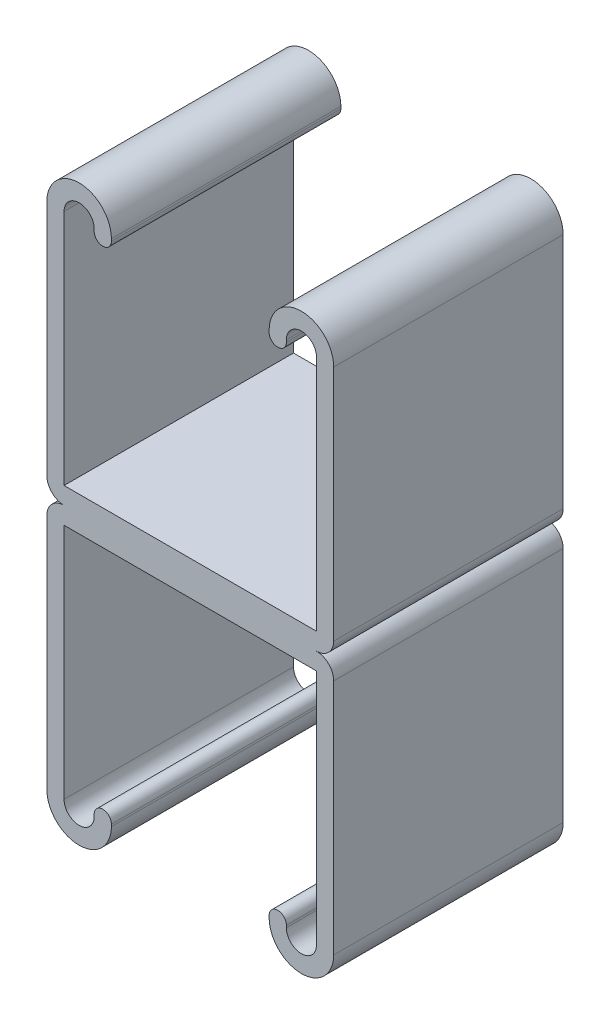
ISO-10303-21;
HEADER;
FILE_DESCRIPTION(('STEP AP214'),'2;1');
FILE_NAME('part.step','',(''),(''),'','','');
FILE_SCHEMA(('AUTOMOTIVE_DESIGN { 1 0 10303 214 1 1 1 1 }'));
ENDSEC;
DATA;
#1=APPLICATION_CONTEXT('core data for automotive mechanical design processes');
#2=APPLICATION_PROTOCOL_DEFINITION('international standard','automotive_design',2000,#1);
#3=PRODUCT_CONTEXT('',#1,'mechanical');
#4=PRODUCT('Part','Part','',(#3));
#5=PRODUCT_RELATED_PRODUCT_CATEGORY('part','',(#4));
#6=PRODUCT_DEFINITION_FORMATION('','',#4);
#7=PRODUCT_DEFINITION_CONTEXT('part definition',#1,'design');
#8=PRODUCT_DEFINITION('design','',#6,#7);
#9=PRODUCT_DEFINITION_SHAPE('','',#8);
#10=(LENGTH_UNIT() NAMED_UNIT(*) SI_UNIT(.MILLI.,.METRE.));
#11=(NAMED_UNIT(*) PLANE_ANGLE_UNIT() SI_UNIT($,.RADIAN.));
#12=(NAMED_UNIT(*) SI_UNIT($,.STERADIAN.) SOLID_ANGLE_UNIT());
#13=UNCERTAINTY_MEASURE_WITH_UNIT(LENGTH_MEASURE(1.E-05),#10,'distance_accuracy_value','');
#14=(GEOMETRIC_REPRESENTATION_CONTEXT(3) GLOBAL_UNCERTAINTY_ASSIGNED_CONTEXT((#13)) GLOBAL_UNIT_ASSIGNED_CONTEXT((#10,
#11,#12)) REPRESENTATION_CONTEXT('',''));
#15=CARTESIAN_POINT('',(0.,0.,0.));
#16=DIRECTION('',(0.,0.,1.));
#17=DIRECTION('',(1.,0.,0.));
#18=AXIS2_PLACEMENT_3D('',#15,#16,#17);
#19=CARTESIAN_POINT('',(-12.303125,28.178125,12.7));
#20=DIRECTION('',(0.,0.,-1.));
#21=DIRECTION('',(-1.,0.,0.));
#22=AXIS2_PLACEMENT_3D('',#19,#20,#21);
#23=CYLINDRICAL_SURFACE('',#22,3.571875);
#24=CARTESIAN_POINT('',(-12.303125,28.178125,-12.7));
#25=DIRECTION('',(0.,0.,1.));
#26=DIRECTION('',(-1.,0.,0.));
#27=AXIS2_PLACEMENT_3D('',#24,#25,#26);
#28=CIRCLE('',#27,3.571875);
#29=CARTESIAN_POINT('',(-8.73125,28.178125,-12.7));
#30=VERTEX_POINT('',#29);
#31=CARTESIAN_POINT('',(-15.875,28.178125,-12.7));
#32=VERTEX_POINT('',#31);
#33=EDGE_CURVE('E189',#30,#32,#28,.T.);
#34=ORIENTED_EDGE('',*,*,#33,.T.);
#35=DIRECTION('',(0.,0.,-1.));
#36=VECTOR('',#35,1.);
#37=CARTESIAN_POINT('',(-15.875,28.178125,12.7));
#38=LINE('',#37,#36);
#39=CARTESIAN_POINT('',(-15.875,28.178125,12.7));
#40=VERTEX_POINT('',#39);
#41=EDGE_CURVE('E11',#40,#32,#38,.T.);
#42=ORIENTED_EDGE('',*,*,#41,.F.);
#43=CARTESIAN_POINT('',(-12.303125,28.178125,12.7));
#44=DIRECTION('',(0.,0.,1.));
#45=DIRECTION('',(-1.,0.,0.));
#46=AXIS2_PLACEMENT_3D('',#43,#44,#45);
#47=CIRCLE('',#46,3.571875);
#48=CARTESIAN_POINT('',(-8.73125,28.178125,12.7));
#49=VERTEX_POINT('',#48);
#50=EDGE_CURVE('E222',#49,#40,#47,.T.);
#51=ORIENTED_EDGE('',*,*,#50,.F.);
#52=DIRECTION('',(0.,0.,-1.));
#53=VECTOR('',#52,1.);
#54=CARTESIAN_POINT('',(-8.73125,28.178125,12.7));
#55=LINE('',#54,#53);
#56=EDGE_CURVE('E185',#49,#30,#55,.T.);
#57=ORIENTED_EDGE('',*,*,#56,.T.);
#58=EDGE_LOOP('',(#34,#42,#51,#57));
#59=FACE_BOUND('',#58,.T.);
#60=ADVANCED_FACE('F32',(#59),#23,.T.);
#61=CARTESIAN_POINT('',(-15.875,28.178125,12.7));
#62=DIRECTION('',(1.,0.,0.));
#63=DIRECTION('',(0.,1.,0.));
#64=AXIS2_PLACEMENT_3D('',#61,#62,#63);
#65=PLANE('',#64);
#66=DIRECTION('',(0.,-1.,0.));
#67=VECTOR('',#66,1.);
#68=CARTESIAN_POINT('',(-15.875,28.178125,-12.7));
#69=LINE('',#68,#67);
#70=CARTESIAN_POINT('',(-15.875,1.905,-12.7));
#71=VERTEX_POINT('',#70);
#72=EDGE_CURVE('E192',#32,#71,#69,.T.);
#73=ORIENTED_EDGE('',*,*,#72,.T.);
#74=DIRECTION('',(0.,0.,-1.));
#75=VECTOR('',#74,1.);
#76=CARTESIAN_POINT('',(-15.875,1.905,12.7));
#77=LINE('',#76,#75);
#78=CARTESIAN_POINT('',(-15.875,1.905,12.7));
#79=VERTEX_POINT('',#78);
#80=EDGE_CURVE('E40',#79,#71,#77,.T.);
#81=ORIENTED_EDGE('',*,*,#80,.F.);
#82=DIRECTION('',(0.,-1.,0.));
#83=VECTOR('',#82,1.);
#84=CARTESIAN_POINT('',(-15.875,28.178125,12.7));
#85=LINE('',#84,#83);
#86=EDGE_CURVE('E119',#40,#79,#85,.T.);
#87=ORIENTED_EDGE('',*,*,#86,.F.);
#88=ORIENTED_EDGE('',*,*,#41,.T.);
#89=EDGE_LOOP('',(#73,#81,#87,#88));
#90=FACE_BOUND('',#89,.T.);
#91=ADVANCED_FACE('F384',(#90),#65,.F.);
#92=CARTESIAN_POINT('',(-13.97,1.905,12.7));
#93=DIRECTION('',(0.,0.,-1.));
#94=DIRECTION('',(-1.,0.,0.));
#95=AXIS2_PLACEMENT_3D('',#92,#93,#94);
#96=CYLINDRICAL_SURFACE('',#95,1.905);
#97=CARTESIAN_POINT('',(-13.97,1.905,-12.7));
#98=DIRECTION('',(0.,0.,1.));
#99=DIRECTION('',(-1.,0.,0.));
#100=AXIS2_PLACEMENT_3D('',#97,#98,#99);
#101=CIRCLE('',#100,1.905);
#102=CARTESIAN_POINT('',(-13.97,0.,-12.7));
#103=VERTEX_POINT('',#102);
#104=EDGE_CURVE('E195',#71,#103,#101,.T.);
#105=ORIENTED_EDGE('',*,*,#104,.T.);
#106=DIRECTION('',(0.,0.,-1.));
#107=VECTOR('',#106,1.);
#108=CARTESIAN_POINT('',(-13.97,0.,12.7));
#109=LINE('',#108,#107);
#110=CARTESIAN_POINT('',(-13.97,0.,12.7));
#111=VERTEX_POINT('',#110);
#112=EDGE_CURVE('E259',#111,#103,#109,.T.);
#113=ORIENTED_EDGE('',*,*,#112,.F.);
#114=CARTESIAN_POINT('',(-13.97,1.905,12.7));
#115=DIRECTION('',(0.,0.,1.));
#116=DIRECTION('',(-1.,0.,0.));
#117=AXIS2_PLACEMENT_3D('',#114,#115,#116);
#118=CIRCLE('',#117,1.905);
#119=EDGE_CURVE('E267',#79,#111,#118,.T.);
#120=ORIENTED_EDGE('',*,*,#119,.F.);
#121=ORIENTED_EDGE('',*,*,#80,.T.);
#122=EDGE_LOOP('',(#105,#113,#120,#121));
#123=FACE_BOUND('',#122,.T.);
#124=ADVANCED_FACE('F265',(#123),#96,.T.);
#125=CARTESIAN_POINT('',(13.97,1.905,12.7));
#126=DIRECTION('',(0.,0.,-1.));
#127=DIRECTION('',(-1.,0.,0.));
#128=AXIS2_PLACEMENT_3D('',#125,#126,#127);
#129=CYLINDRICAL_SURFACE('',#128,1.905);
#130=CARTESIAN_POINT('',(13.97,1.905,-12.7));
#131=DIRECTION('',(0.,0.,1.));
#132=DIRECTION('',(1.,0.,0.));
#133=AXIS2_PLACEMENT_3D('',#130,#131,#132);
#134=CIRCLE('',#133,1.905);
#135=CARTESIAN_POINT('',(13.97,0.,-12.7));
#136=VERTEX_POINT('',#135);
#137=CARTESIAN_POINT('',(15.875,1.905,-12.7));
#138=VERTEX_POINT('',#137);
#139=EDGE_CURVE('E197',#136,#138,#134,.T.);
#140=ORIENTED_EDGE('',*,*,#139,.T.);
#141=DIRECTION('',(0.,0.,-1.));
#142=VECTOR('',#141,1.);
#143=CARTESIAN_POINT('',(15.875,1.905,12.7));
#144=LINE('',#143,#142);
#145=CARTESIAN_POINT('',(15.875,1.905,12.7));
#146=VERTEX_POINT('',#145);
#147=EDGE_CURVE('E253',#146,#138,#144,.T.);
#148=ORIENTED_EDGE('',*,*,#147,.F.);
#149=CARTESIAN_POINT('',(13.97,1.905,12.7));
#150=DIRECTION('',(0.,0.,1.));
#151=DIRECTION('',(1.,0.,0.));
#152=AXIS2_PLACEMENT_3D('',#149,#150,#151);
#153=CIRCLE('',#152,1.905);
#154=CARTESIAN_POINT('',(13.97,0.,12.7));
#155=VERTEX_POINT('',#154);
#156=EDGE_CURVE('E341',#155,#146,#153,.T.);
#157=ORIENTED_EDGE('',*,*,#156,.F.);
#158=DIRECTION('',(0.,0.,-1.));
#159=VECTOR('',#158,1.);
#160=CARTESIAN_POINT('',(13.97,0.,12.7));
#161=LINE('',#160,#159);
#162=EDGE_CURVE('E256',#155,#136,#161,.T.);
#163=ORIENTED_EDGE('',*,*,#162,.T.);
#164=EDGE_LOOP('',(#140,#148,#157,#163));
#165=FACE_BOUND('',#164,.T.);
#166=ADVANCED_FACE('F391',(#165),#129,.T.);
#167=CARTESIAN_POINT('',(15.875,1.905,12.7));
#168=DIRECTION('',(-1.,0.,0.));
#169=DIRECTION('',(0.,0.,1.));
#170=AXIS2_PLACEMENT_3D('',#167,#168,#169);
#171=PLANE('',#170);
#172=DIRECTION('',(0.,1.,0.));
#173=VECTOR('',#172,1.);
#174=CARTESIAN_POINT('',(15.875,1.905,-12.7));
#175=LINE('',#174,#173);
#176=CARTESIAN_POINT('',(15.875,28.178125,-12.7));
#177=VERTEX_POINT('',#176);
#178=EDGE_CURVE('E199',#138,#177,#175,.T.);
#179=ORIENTED_EDGE('',*,*,#178,.T.);
#180=DIRECTION('',(0.,0.,-1.));
#181=VECTOR('',#180,1.);
#182=CARTESIAN_POINT('',(15.875,28.178125,12.7));
#183=LINE('',#182,#181);
#184=CARTESIAN_POINT('',(15.875,28.178125,12.7));
#185=VERTEX_POINT('',#184);
#186=EDGE_CURVE('E250',#185,#177,#183,.T.);
#187=ORIENTED_EDGE('',*,*,#186,.F.);
#188=DIRECTION('',(0.,1.,0.));
#189=VECTOR('',#188,1.);
#190=CARTESIAN_POINT('',(15.875,1.905,12.7));
#191=LINE('',#190,#189);
#192=EDGE_CURVE('E343',#146,#185,#191,.T.);
#193=ORIENTED_EDGE('',*,*,#192,.F.);
#194=ORIENTED_EDGE('',*,*,#147,.T.);
#195=EDGE_LOOP('',(#179,#187,#193,#194));
#196=FACE_BOUND('',#195,.T.);
#197=ADVANCED_FACE('F396',(#196),#171,.F.);
#198=CARTESIAN_POINT('',(12.303125,28.178125,12.7));
#199=DIRECTION('',(0.,0.,-1.));
#200=DIRECTION('',(-1.,0.,0.));
#201=AXIS2_PLACEMENT_3D('',#198,#199,#200);
#202=CYLINDRICAL_SURFACE('',#201,3.571875);
#203=CARTESIAN_POINT('',(12.303125,28.178125,-12.7));
#204=DIRECTION('',(0.,0.,1.));
#205=DIRECTION('',(1.,0.,0.));
#206=AXIS2_PLACEMENT_3D('',#203,#204,#205);
#207=CIRCLE('',#206,3.571875);
#208=CARTESIAN_POINT('',(8.73125,28.178125,-12.7));
#209=VERTEX_POINT('',#208);
#210=EDGE_CURVE('E201',#177,#209,#207,.T.);
#211=ORIENTED_EDGE('',*,*,#210,.T.);
#212=DIRECTION('',(0.,0.,-1.));
#213=VECTOR('',#212,1.);
#214=CARTESIAN_POINT('',(8.73125,28.178125,12.7));
#215=LINE('',#214,#213);
#216=CARTESIAN_POINT('',(8.73125,28.178125,12.7));
#217=VERTEX_POINT('',#216);
#218=EDGE_CURVE('E247',#217,#209,#215,.T.);
#219=ORIENTED_EDGE('',*,*,#218,.F.);
#220=CARTESIAN_POINT('',(12.303125,28.178125,12.7));
#221=DIRECTION('',(0.,0.,1.));
#222=DIRECTION('',(1.,0.,0.));
#223=AXIS2_PLACEMENT_3D('',#220,#221,#222);
#224=CIRCLE('',#223,3.571875);
#225=EDGE_CURVE('E345',#185,#217,#224,.T.);
#226=ORIENTED_EDGE('',*,*,#225,.F.);
#227=ORIENTED_EDGE('',*,*,#186,.T.);
#228=EDGE_LOOP('',(#211,#219,#226,#227));
#229=FACE_BOUND('',#228,.T.);
#230=ADVANCED_FACE('F400',(#229),#202,.T.);
#231=CARTESIAN_POINT('',(8.73125,28.178125,12.7));
#232=DIRECTION('',(1.,0.,0.));
#233=DIRECTION('',(0.,1.,0.));
#234=AXIS2_PLACEMENT_3D('',#231,#232,#233);
#235=PLANE('',#234);
#236=DIRECTION('',(0.,-1.,0.));
#237=VECTOR('',#236,1.);
#238=CARTESIAN_POINT('',(8.73125,28.178125,-12.7));
#239=LINE('',#238,#237);
#240=CARTESIAN_POINT('',(8.73125,27.94,-12.7));
#241=VERTEX_POINT('',#240);
#242=EDGE_CURVE('E203',#209,#241,#239,.T.);
#243=ORIENTED_EDGE('',*,*,#242,.T.);
#244=DIRECTION('',(0.,0.,-1.));
#245=VECTOR('',#244,1.);
#246=CARTESIAN_POINT('',(8.73125,27.94,12.7));
#247=LINE('',#246,#245);
#248=CARTESIAN_POINT('',(8.73125,27.94,12.7));
#249=VERTEX_POINT('',#248);
#250=EDGE_CURVE('E244',#249,#241,#247,.T.);
#251=ORIENTED_EDGE('',*,*,#250,.F.);
#252=DIRECTION('',(0.,-1.,0.));
#253=VECTOR('',#252,1.);
#254=CARTESIAN_POINT('',(8.73125,28.178125,12.7));
#255=LINE('',#254,#253);
#256=EDGE_CURVE('E347',#217,#249,#255,.T.);
#257=ORIENTED_EDGE('',*,*,#256,.F.);
#258=ORIENTED_EDGE('',*,*,#218,.T.);
#259=EDGE_LOOP('',(#243,#251,#257,#258));
#260=FACE_BOUND('',#259,.T.);
#261=ADVANCED_FACE('F404',(#260),#235,.F.);
#262=CARTESIAN_POINT('',(9.68375,27.94,12.7));
#263=DIRECTION('',(0.,0.,-1.));
#264=DIRECTION('',(-1.,0.,0.));
#265=AXIS2_PLACEMENT_3D('',#262,#263,#264);
#266=CYLINDRICAL_SURFACE('',#265,0.9525);
#267=CARTESIAN_POINT('',(9.68375,27.94,-12.7));
#268=DIRECTION('',(0.,0.,1.));
#269=DIRECTION('',(1.,0.,0.));
#270=AXIS2_PLACEMENT_3D('',#267,#268,#269);
#271=CIRCLE('',#270,0.9525);
#272=CARTESIAN_POINT('',(10.63625,27.94,-12.7));
#273=VERTEX_POINT('',#272);
#274=EDGE_CURVE('E205',#241,#273,#271,.T.);
#275=ORIENTED_EDGE('',*,*,#274,.T.);
#276=DIRECTION('',(0.,0.,-1.));
#277=VECTOR('',#276,1.);
#278=CARTESIAN_POINT('',(10.63625,27.94,12.7));
#279=LINE('',#278,#277);
#280=CARTESIAN_POINT('',(10.63625,27.94,12.7));
#281=VERTEX_POINT('',#280);
#282=EDGE_CURVE('E241',#281,#273,#279,.T.);
#283=ORIENTED_EDGE('',*,*,#282,.F.);
#284=CARTESIAN_POINT('',(9.68375,27.94,12.7));
#285=DIRECTION('',(0.,0.,1.));
#286=DIRECTION('',(1.,0.,0.));
#287=AXIS2_PLACEMENT_3D('',#284,#285,#286);
#288=CIRCLE('',#287,0.9525);
#289=EDGE_CURVE('E349',#249,#281,#288,.T.);
#290=ORIENTED_EDGE('',*,*,#289,.F.);
#291=ORIENTED_EDGE('',*,*,#250,.T.);
#292=EDGE_LOOP('',(#275,#283,#290,#291));
#293=FACE_BOUND('',#292,.T.);
#294=ADVANCED_FACE('F408',(#293),#266,.T.);
#295=CARTESIAN_POINT('',(10.63625,28.178125,12.7));
#296=DIRECTION('',(-1.,0.,0.));
#297=DIRECTION('',(0.,0.,1.));
#298=AXIS2_PLACEMENT_3D('',#295,#296,#297);
#299=PLANE('',#298);
#300=DIRECTION('',(0.,1.,0.));
#301=VECTOR('',#300,1.);
#302=CARTESIAN_POINT('',(10.63625,28.178125,-12.7));
#303=LINE('',#302,#301);
#304=CARTESIAN_POINT('',(10.63625,28.178125,-12.7));
#305=VERTEX_POINT('',#304);
#306=EDGE_CURVE('E207',#273,#305,#303,.T.);
#307=ORIENTED_EDGE('',*,*,#306,.T.);
#308=DIRECTION('',(0.,0.,-1.));
#309=VECTOR('',#308,1.);
#310=CARTESIAN_POINT('',(10.63625,28.178125,12.7));
#311=LINE('',#310,#309);
#312=CARTESIAN_POINT('',(10.63625,28.178125,12.7));
#313=VERTEX_POINT('',#312);
#314=EDGE_CURVE('E238',#313,#305,#311,.T.);
#315=ORIENTED_EDGE('',*,*,#314,.F.);
#316=DIRECTION('',(0.,1.,0.));
#317=VECTOR('',#316,1.);
#318=CARTESIAN_POINT('',(10.63625,28.178125,12.7));
#319=LINE('',#318,#317);
#320=EDGE_CURVE('E351',#281,#313,#319,.T.);
#321=ORIENTED_EDGE('',*,*,#320,.F.);
#322=ORIENTED_EDGE('',*,*,#282,.T.);
#323=EDGE_LOOP('',(#307,#315,#321,#322));
#324=FACE_BOUND('',#323,.T.);
#325=ADVANCED_FACE('F412',(#324),#299,.F.);
#326=CARTESIAN_POINT('',(12.303125,28.178125,12.7));
#327=DIRECTION('',(0.,0.,-1.));
#328=DIRECTION('',(-1.,0.,0.));
#329=AXIS2_PLACEMENT_3D('',#326,#327,#328);
#330=CYLINDRICAL_SURFACE('',#329,1.666875);
#331=CARTESIAN_POINT('',(12.303125,28.178125,-12.7));
#332=DIRECTION('',(0.,0.,-1.));
#333=DIRECTION('',(1.,0.,0.));
#334=AXIS2_PLACEMENT_3D('',#331,#332,#333);
#335=CIRCLE('',#334,1.666875);
#336=CARTESIAN_POINT('',(13.97,28.178125,-12.7));
#337=VERTEX_POINT('',#336);
#338=EDGE_CURVE('E209',#305,#337,#335,.T.);
#339=ORIENTED_EDGE('',*,*,#338,.T.);
#340=DIRECTION('',(0.,0.,-1.));
#341=VECTOR('',#340,1.);
#342=CARTESIAN_POINT('',(13.97,28.178125,12.7));
#343=LINE('',#342,#341);
#344=CARTESIAN_POINT('',(13.97,28.178125,12.7));
#345=VERTEX_POINT('',#344);
#346=EDGE_CURVE('E235',#345,#337,#343,.T.);
#347=ORIENTED_EDGE('',*,*,#346,.F.);
#348=CARTESIAN_POINT('',(12.303125,28.178125,12.7));
#349=DIRECTION('',(0.,0.,-1.));
#350=DIRECTION('',(1.,0.,0.));
#351=AXIS2_PLACEMENT_3D('',#348,#349,#350);
#352=CIRCLE('',#351,1.666875);
#353=EDGE_CURVE('E353',#313,#345,#352,.T.);
#354=ORIENTED_EDGE('',*,*,#353,.F.);
#355=ORIENTED_EDGE('',*,*,#314,.T.);
#356=EDGE_LOOP('',(#339,#347,#354,#355));
#357=FACE_BOUND('',#356,.T.);
#358=ADVANCED_FACE('F416',(#357),#330,.F.);
#359=CARTESIAN_POINT('',(13.97,1.905,12.7));
#360=DIRECTION('',(1.,0.,0.));
#361=DIRECTION('',(0.,0.,-1.));
#362=AXIS2_PLACEMENT_3D('',#359,#360,#361);
#363=PLANE('',#362);
#364=DIRECTION('',(0.,-1.,0.));
#365=VECTOR('',#364,1.);
#366=CARTESIAN_POINT('',(13.97,1.905,-12.7));
#367=LINE('',#366,#365);
#368=CARTESIAN_POINT('',(13.97,1.905,-12.7));
#369=VERTEX_POINT('',#368);
#370=EDGE_CURVE('E211',#337,#369,#367,.T.);
#371=ORIENTED_EDGE('',*,*,#370,.T.);
#372=DIRECTION('',(0.,0.,-1.));
#373=VECTOR('',#372,1.);
#374=CARTESIAN_POINT('',(13.97,1.905,12.7));
#375=LINE('',#374,#373);
#376=CARTESIAN_POINT('',(13.97,1.905,12.7));
#377=VERTEX_POINT('',#376);
#378=EDGE_CURVE('E232',#377,#369,#375,.T.);
#379=ORIENTED_EDGE('',*,*,#378,.F.);
#380=DIRECTION('',(0.,-1.,0.));
#381=VECTOR('',#380,1.);
#382=CARTESIAN_POINT('',(13.97,1.905,12.7));
#383=LINE('',#382,#381);
#384=EDGE_CURVE('E355',#345,#377,#383,.T.);
#385=ORIENTED_EDGE('',*,*,#384,.F.);
#386=ORIENTED_EDGE('',*,*,#346,.T.);
#387=EDGE_LOOP('',(#371,#379,#385,#386));
#388=FACE_BOUND('',#387,.T.);
#389=ADVANCED_FACE('F420',(#388),#363,.F.);
#390=CARTESIAN_POINT('',(-13.97,1.905,12.7));
#391=DIRECTION('',(0.,-1.,0.));
#392=DIRECTION('',(1.,0.,0.));
#393=AXIS2_PLACEMENT_3D('',#390,#391,#392);
#394=PLANE('',#393);
#395=DIRECTION('',(-1.,0.,0.));
#396=VECTOR('',#395,1.);
#397=CARTESIAN_POINT('',(-13.97,1.905,-12.7));
#398=LINE('',#397,#396);
#399=CARTESIAN_POINT('',(-13.97,1.905,-12.7));
#400=VERTEX_POINT('',#399);
#401=EDGE_CURVE('E213',#369,#400,#398,.T.);
#402=ORIENTED_EDGE('',*,*,#401,.T.);
#403=DIRECTION('',(0.,0.,-1.));
#404=VECTOR('',#403,1.);
#405=CARTESIAN_POINT('',(-13.97,1.905,12.7));
#406=LINE('',#405,#404);
#407=CARTESIAN_POINT('',(-13.97,1.905,12.7));
#408=VERTEX_POINT('',#407);
#409=EDGE_CURVE('E229',#408,#400,#406,.T.);
#410=ORIENTED_EDGE('',*,*,#409,.F.);
#411=DIRECTION('',(-1.,0.,0.));
#412=VECTOR('',#411,1.);
#413=CARTESIAN_POINT('',(-13.97,1.905,12.7));
#414=LINE('',#413,#412);
#415=EDGE_CURVE('E357',#377,#408,#414,.T.);
#416=ORIENTED_EDGE('',*,*,#415,.F.);
#417=ORIENTED_EDGE('',*,*,#378,.T.);
#418=EDGE_LOOP('',(#402,#410,#416,#417));
#419=FACE_BOUND('',#418,.T.);
#420=ADVANCED_FACE('F424',(#419),#394,.F.);
#421=CARTESIAN_POINT('',(-13.97,28.178125,12.7));
#422=DIRECTION('',(-1.,0.,0.));
#423=DIRECTION('',(0.,-1.,0.));
#424=AXIS2_PLACEMENT_3D('',#421,#422,#423);
#425=PLANE('',#424);
#426=DIRECTION('',(0.,1.,0.));
#427=VECTOR('',#426,1.);
#428=CARTESIAN_POINT('',(-13.97,28.178125,-12.7));
#429=LINE('',#428,#427);
#430=CARTESIAN_POINT('',(-13.97,28.178125,-12.7));
#431=VERTEX_POINT('',#430);
#432=EDGE_CURVE('E215',#400,#431,#429,.T.);
#433=ORIENTED_EDGE('',*,*,#432,.T.);
#434=DIRECTION('',(0.,0.,-1.));
#435=VECTOR('',#434,1.);
#436=CARTESIAN_POINT('',(-13.97,28.178125,12.7));
#437=LINE('',#436,#435);
#438=CARTESIAN_POINT('',(-13.97,28.178125,12.7));
#439=VERTEX_POINT('',#438);
#440=EDGE_CURVE('E226',#439,#431,#437,.T.);
#441=ORIENTED_EDGE('',*,*,#440,.F.);
#442=DIRECTION('',(0.,1.,0.));
#443=VECTOR('',#442,1.);
#444=CARTESIAN_POINT('',(-13.97,28.178125,12.7));
#445=LINE('',#444,#443);
#446=EDGE_CURVE('E359',#408,#439,#445,.T.);
#447=ORIENTED_EDGE('',*,*,#446,.F.);
#448=ORIENTED_EDGE('',*,*,#409,.T.);
#449=EDGE_LOOP('',(#433,#441,#447,#448));
#450=FACE_BOUND('',#449,.T.);
#451=ADVANCED_FACE('F365',(#450),#425,.F.);
#452=CARTESIAN_POINT('',(-12.303125,28.178125,12.7));
#453=DIRECTION('',(0.,0.,-1.));
#454=DIRECTION('',(-1.,0.,0.));
#455=AXIS2_PLACEMENT_3D('',#452,#453,#454);
#456=CYLINDRICAL_SURFACE('',#455,1.666875);
#457=CARTESIAN_POINT('',(-12.303125,28.178125,-12.7));
#458=DIRECTION('',(0.,0.,-1.));
#459=DIRECTION('',(-1.,0.,0.));
#460=AXIS2_PLACEMENT_3D('',#457,#458,#459);
#461=CIRCLE('',#460,1.666875);
#462=CARTESIAN_POINT('',(-10.63625,28.178125,-12.7));
#463=VERTEX_POINT('',#462);
#464=EDGE_CURVE('E217',#431,#463,#461,.T.);
#465=ORIENTED_EDGE('',*,*,#464,.T.);
#466=DIRECTION('',(0.,0.,-1.));
#467=VECTOR('',#466,1.);
#468=CARTESIAN_POINT('',(-10.63625,28.178125,12.7));
#469=LINE('',#468,#467);
#470=CARTESIAN_POINT('',(-10.63625,28.178125,12.7));
#471=VERTEX_POINT('',#470);
#472=EDGE_CURVE('E180',#471,#463,#469,.T.);
#473=ORIENTED_EDGE('',*,*,#472,.F.);
#474=CARTESIAN_POINT('',(-12.303125,28.178125,12.7));
#475=DIRECTION('',(0.,0.,-1.));
#476=DIRECTION('',(-1.,0.,0.));
#477=AXIS2_PLACEMENT_3D('',#474,#475,#476);
#478=CIRCLE('',#477,1.666875);
#479=EDGE_CURVE('E171',#439,#471,#478,.T.);
#480=ORIENTED_EDGE('',*,*,#479,.F.);
#481=ORIENTED_EDGE('',*,*,#440,.T.);
#482=EDGE_LOOP('',(#465,#473,#480,#481));
#483=FACE_BOUND('',#482,.T.);
#484=ADVANCED_FACE('F369',(#483),#456,.F.);
#485=CARTESIAN_POINT('',(-10.63625,28.178125,12.7));
#486=DIRECTION('',(1.,0.,0.));
#487=DIRECTION('',(0.,1.,0.));
#488=AXIS2_PLACEMENT_3D('',#485,#486,#487);
#489=PLANE('',#488);
#490=DIRECTION('',(0.,-1.,0.));
#491=VECTOR('',#490,1.);
#492=CARTESIAN_POINT('',(-10.63625,28.178125,-12.7));
#493=LINE('',#492,#491);
#494=CARTESIAN_POINT('',(-10.63625,27.94,-12.7));
#495=VERTEX_POINT('',#494);
#496=EDGE_CURVE('E179',#463,#495,#493,.T.);
#497=ORIENTED_EDGE('',*,*,#496,.T.);
#498=DIRECTION('',(0.,0.,-1.));
#499=VECTOR('',#498,1.);
#500=CARTESIAN_POINT('',(-10.63625,27.94,12.7));
#501=LINE('',#500,#499);
#502=CARTESIAN_POINT('',(-10.63625,27.94,12.7));
#503=VERTEX_POINT('',#502);
#504=EDGE_CURVE('E176',#503,#495,#501,.T.);
#505=ORIENTED_EDGE('',*,*,#504,.F.);
#506=DIRECTION('',(0.,-1.,0.));
#507=VECTOR('',#506,1.);
#508=CARTESIAN_POINT('',(-10.63625,28.178125,12.7));
#509=LINE('',#508,#507);
#510=EDGE_CURVE('E165',#471,#503,#509,.T.);
#511=ORIENTED_EDGE('',*,*,#510,.F.);
#512=ORIENTED_EDGE('',*,*,#472,.T.);
#513=EDGE_LOOP('',(#497,#505,#511,#512));
#514=FACE_BOUND('',#513,.T.);
#515=ADVANCED_FACE('F177',(#514),#489,.F.);
#516=CARTESIAN_POINT('',(-9.68375,27.94,12.7));
#517=DIRECTION('',(0.,0.,-1.));
#518=DIRECTION('',(-1.,0.,0.));
#519=AXIS2_PLACEMENT_3D('',#516,#517,#518);
#520=CYLINDRICAL_SURFACE('',#519,0.9525);
#521=CARTESIAN_POINT('',(-9.68375,27.94,-12.7));
#522=DIRECTION('',(0.,0.,1.));
#523=DIRECTION('',(-1.,0.,0.));
#524=AXIS2_PLACEMENT_3D('',#521,#522,#523);
#525=CIRCLE('',#524,0.9525);
#526=CARTESIAN_POINT('',(-8.73125,27.94,-12.7));
#527=VERTEX_POINT('',#526);
#528=EDGE_CURVE('E105',#495,#527,#525,.T.);
#529=ORIENTED_EDGE('',*,*,#528,.T.);
#530=DIRECTION('',(0.,0.,-1.));
#531=VECTOR('',#530,1.);
#532=CARTESIAN_POINT('',(-8.73125,27.94,12.7));
#533=LINE('',#532,#531);
#534=CARTESIAN_POINT('',(-8.73125,27.94,12.7));
#535=VERTEX_POINT('',#534);
#536=EDGE_CURVE('E181',#535,#527,#533,.T.);
#537=ORIENTED_EDGE('',*,*,#536,.F.);
#538=CARTESIAN_POINT('',(-9.68375,27.94,12.7));
#539=DIRECTION('',(0.,0.,1.));
#540=DIRECTION('',(-1.,0.,0.));
#541=AXIS2_PLACEMENT_3D('',#538,#539,#540);
#542=CIRCLE('',#541,0.9525);
#543=EDGE_CURVE('E169',#503,#535,#542,.T.);
#544=ORIENTED_EDGE('',*,*,#543,.F.);
#545=ORIENTED_EDGE('',*,*,#504,.T.);
#546=EDGE_LOOP('',(#529,#537,#544,#545));
#547=FACE_BOUND('',#546,.T.);
#548=ADVANCED_FACE('F183',(#547),#520,.T.);
#549=CARTESIAN_POINT('',(-8.73125,28.178125,12.7));
#550=DIRECTION('',(-1.,0.,0.));
#551=DIRECTION('',(0.,-1.,0.));
#552=AXIS2_PLACEMENT_3D('',#549,#550,#551);
#553=PLANE('',#552);
#554=DIRECTION('',(0.,1.,0.));
#555=VECTOR('',#554,1.);
#556=CARTESIAN_POINT('',(-8.73125,28.178125,-12.7));
#557=LINE('',#556,#555);
#558=EDGE_CURVE('E111',#527,#30,#557,.T.);
#559=ORIENTED_EDGE('',*,*,#558,.T.);
#560=ORIENTED_EDGE('',*,*,#56,.F.);
#561=DIRECTION('',(0.,1.,0.));
#562=VECTOR('',#561,1.);
#563=CARTESIAN_POINT('',(-8.73125,28.178125,12.7));
#564=LINE('',#563,#562);
#565=EDGE_CURVE('E48',#535,#49,#564,.T.);
#566=ORIENTED_EDGE('',*,*,#565,.F.);
#567=ORIENTED_EDGE('',*,*,#536,.T.);
#568=EDGE_LOOP('',(#559,#560,#566,#567));
#569=FACE_BOUND('',#568,.T.);
#570=ADVANCED_FACE('F373',(#569),#553,.F.);
#571=CARTESIAN_POINT('',(-12.303125,28.178125,12.7));
#572=DIRECTION('',(0.,0.,-1.));
#573=DIRECTION('',(-1.,0.,0.));
#574=AXIS2_PLACEMENT_3D('',#571,#572,#573);
#575=PLANE('',#574);
#576=ORIENTED_EDGE('',*,*,#50,.T.);
#577=ORIENTED_EDGE('',*,*,#86,.T.);
#578=ORIENTED_EDGE('',*,*,#119,.T.);
#579=CARTESIAN_POINT('',(-13.97,-1.905,12.7));
#580=DIRECTION('',(0.,0.,-1.));
#581=DIRECTION('',(-1.,0.,0.));
#582=AXIS2_PLACEMENT_3D('',#579,#580,#581);
#583=CIRCLE('',#582,1.905);
#584=CARTESIAN_POINT('',(-15.875,-1.905,12.7));
#585=VERTEX_POINT('',#584);
#586=EDGE_CURVE('E782',#585,#111,#583,.T.);
#587=ORIENTED_EDGE('',*,*,#586,.F.);
#588=DIRECTION('',(0.,1.,0.));
#589=VECTOR('',#588,1.);
#590=CARTESIAN_POINT('',(-15.875,-28.178125,12.7));
#591=LINE('',#590,#589);
#592=CARTESIAN_POINT('',(-15.875,-28.178125,12.7));
#593=VERTEX_POINT('',#592);
#594=EDGE_CURVE('E294',#593,#585,#591,.T.);
#595=ORIENTED_EDGE('',*,*,#594,.F.);
#596=CARTESIAN_POINT('',(-12.303125,-28.178125,12.7));
#597=DIRECTION('',(0.,0.,-1.));
#598=DIRECTION('',(-1.,0.,0.));
#599=AXIS2_PLACEMENT_3D('',#596,#597,#598);
#600=CIRCLE('',#599,3.571875);
#601=CARTESIAN_POINT('',(-8.73125,-28.178125,12.7));
#602=VERTEX_POINT('',#601);
#603=EDGE_CURVE('E283',#602,#593,#600,.T.);
#604=ORIENTED_EDGE('',*,*,#603,.F.);
#605=DIRECTION('',(0.,-1.,0.));
#606=VECTOR('',#605,1.);
#607=CARTESIAN_POINT('',(-8.73125,-28.178125,12.7));
#608=LINE('',#607,#606);
#609=CARTESIAN_POINT('',(-8.73125,-27.94,12.7));
#610=VERTEX_POINT('',#609);
#611=EDGE_CURVE('E731',#610,#602,#608,.T.);
#612=ORIENTED_EDGE('',*,*,#611,.F.);
#613=CARTESIAN_POINT('',(-9.68375,-27.94,12.7));
#614=DIRECTION('',(0.,0.,-1.));
#615=DIRECTION('',(-1.,0.,0.));
#616=AXIS2_PLACEMENT_3D('',#613,#614,#615);
#617=CIRCLE('',#616,0.9525);
#618=CARTESIAN_POINT('',(-10.63625,-27.94,12.7));
#619=VERTEX_POINT('',#618);
#620=EDGE_CURVE('E740',#619,#610,#617,.T.);
#621=ORIENTED_EDGE('',*,*,#620,.F.);
#622=DIRECTION('',(0.,1.,0.));
#623=VECTOR('',#622,1.);
#624=CARTESIAN_POINT('',(-10.63625,-28.178125,12.7));
#625=LINE('',#624,#623);
#626=CARTESIAN_POINT('',(-10.63625,-28.178125,12.7));
#627=VERTEX_POINT('',#626);
#628=EDGE_CURVE('E744',#627,#619,#625,.T.);
#629=ORIENTED_EDGE('',*,*,#628,.F.);
#630=CARTESIAN_POINT('',(-12.303125,-28.178125,12.7));
#631=DIRECTION('',(0.,0.,1.));
#632=DIRECTION('',(-1.,0.,0.));
#633=AXIS2_PLACEMENT_3D('',#630,#631,#632);
#634=CIRCLE('',#633,1.666875);
#635=CARTESIAN_POINT('',(-13.97,-28.178125,12.7));
#636=VERTEX_POINT('',#635);
#637=EDGE_CURVE('E746',#636,#627,#634,.T.);
#638=ORIENTED_EDGE('',*,*,#637,.F.);
#639=DIRECTION('',(0.,-1.,0.));
#640=VECTOR('',#639,1.);
#641=CARTESIAN_POINT('',(-13.97,-28.178125,12.7));
#642=LINE('',#641,#640);
#643=CARTESIAN_POINT('',(-13.97,-1.905,12.7));
#644=VERTEX_POINT('',#643);
#645=EDGE_CURVE('E752',#644,#636,#642,.T.);
#646=ORIENTED_EDGE('',*,*,#645,.F.);
#647=DIRECTION('',(-1.,0.,0.));
#648=VECTOR('',#647,1.);
#649=CARTESIAN_POINT('',(-13.97,-1.905,12.7));
#650=LINE('',#649,#648);
#651=CARTESIAN_POINT('',(13.97,-1.905,12.7));
#652=VERTEX_POINT('',#651);
#653=EDGE_CURVE('E755',#652,#644,#650,.T.);
#654=ORIENTED_EDGE('',*,*,#653,.F.);
#655=DIRECTION('',(0.,1.,0.));
#656=VECTOR('',#655,1.);
#657=CARTESIAN_POINT('',(13.97,-1.905,12.7));
#658=LINE('',#657,#656);
#659=CARTESIAN_POINT('',(13.97,-28.178125,12.7));
#660=VERTEX_POINT('',#659);
#661=EDGE_CURVE('E758',#660,#652,#658,.T.);
#662=ORIENTED_EDGE('',*,*,#661,.F.);
#663=CARTESIAN_POINT('',(12.303125,-28.178125,12.7));
#664=DIRECTION('',(0.,0.,1.));
#665=DIRECTION('',(1.,0.,0.));
#666=AXIS2_PLACEMENT_3D('',#663,#664,#665);
#667=CIRCLE('',#666,1.666875);
#668=CARTESIAN_POINT('',(10.63625,-28.178125,12.7));
#669=VERTEX_POINT('',#668);
#670=EDGE_CURVE('E761',#669,#660,#667,.T.);
#671=ORIENTED_EDGE('',*,*,#670,.F.);
#672=DIRECTION('',(0.,-1.,0.));
#673=VECTOR('',#672,1.);
#674=CARTESIAN_POINT('',(10.63625,-28.178125,12.7));
#675=LINE('',#674,#673);
#676=CARTESIAN_POINT('',(10.63625,-27.94,12.7));
#677=VERTEX_POINT('',#676);
#678=EDGE_CURVE('E764',#677,#669,#675,.T.);
#679=ORIENTED_EDGE('',*,*,#678,.F.);
#680=CARTESIAN_POINT('',(9.68375,-27.94,12.7));
#681=DIRECTION('',(0.,0.,-1.));
#682=DIRECTION('',(1.,0.,0.));
#683=AXIS2_PLACEMENT_3D('',#680,#681,#682);
#684=CIRCLE('',#683,0.9525);
#685=CARTESIAN_POINT('',(8.73125,-27.94,12.7));
#686=VERTEX_POINT('',#685);
#687=EDGE_CURVE('E767',#686,#677,#684,.T.);
#688=ORIENTED_EDGE('',*,*,#687,.F.);
#689=DIRECTION('',(0.,1.,0.));
#690=VECTOR('',#689,1.);
#691=CARTESIAN_POINT('',(8.73125,-28.178125,12.7));
#692=LINE('',#691,#690);
#693=CARTESIAN_POINT('',(8.73125,-28.178125,12.7));
#694=VERTEX_POINT('',#693);
#695=EDGE_CURVE('E770',#694,#686,#692,.T.);
#696=ORIENTED_EDGE('',*,*,#695,.F.);
#697=CARTESIAN_POINT('',(12.303125,-28.178125,12.7));
#698=DIRECTION('',(0.,0.,-1.));
#699=DIRECTION('',(1.,0.,0.));
#700=AXIS2_PLACEMENT_3D('',#697,#698,#699);
#701=CIRCLE('',#700,3.571875);
#702=CARTESIAN_POINT('',(15.875,-28.178125,12.7));
#703=VERTEX_POINT('',#702);
#704=EDGE_CURVE('E773',#703,#694,#701,.T.);
#705=ORIENTED_EDGE('',*,*,#704,.F.);
#706=DIRECTION('',(0.,-1.,0.));
#707=VECTOR('',#706,1.);
#708=CARTESIAN_POINT('',(15.875,-1.905,12.7));
#709=LINE('',#708,#707);
#710=CARTESIAN_POINT('',(15.875,-1.905,12.7));
#711=VERTEX_POINT('',#710);
#712=EDGE_CURVE('E776',#711,#703,#709,.T.);
#713=ORIENTED_EDGE('',*,*,#712,.F.);
#714=CARTESIAN_POINT('',(13.97,-1.905,12.7));
#715=DIRECTION('',(0.,0.,-1.));
#716=DIRECTION('',(1.,0.,0.));
#717=AXIS2_PLACEMENT_3D('',#714,#715,#716);
#718=CIRCLE('',#717,1.905);
#719=EDGE_CURVE('E779',#155,#711,#718,.T.);
#720=ORIENTED_EDGE('',*,*,#719,.F.);
#721=ORIENTED_EDGE('',*,*,#156,.T.);
#722=ORIENTED_EDGE('',*,*,#192,.T.);
#723=ORIENTED_EDGE('',*,*,#225,.T.);
#724=ORIENTED_EDGE('',*,*,#256,.T.);
#725=ORIENTED_EDGE('',*,*,#289,.T.);
#726=ORIENTED_EDGE('',*,*,#320,.T.);
#727=ORIENTED_EDGE('',*,*,#353,.T.);
#728=ORIENTED_EDGE('',*,*,#384,.T.);
#729=ORIENTED_EDGE('',*,*,#415,.T.);
#730=ORIENTED_EDGE('',*,*,#446,.T.);
#731=ORIENTED_EDGE('',*,*,#479,.T.);
#732=ORIENTED_EDGE('',*,*,#510,.T.);
#733=ORIENTED_EDGE('',*,*,#543,.T.);
#734=ORIENTED_EDGE('',*,*,#565,.T.);
#735=EDGE_LOOP('',(#576,#577,#578,#587,#595,#604,#612,#621,#629,#638,#646,#654,#662,#671,#679,
#688,#696,#705,#713,#720,#721,#722,#723,#724,#725,#726,#727,#728,#729,#730,#731,#732,#733,#734));
#736=FACE_BOUND('',#735,.T.);
#737=ADVANCED_FACE('F167',(#736),#575,.F.);
#738=CARTESIAN_POINT('',(-12.303125,28.178125,-12.7));
#739=DIRECTION('',(0.,0.,-1.));
#740=DIRECTION('',(-1.,0.,0.));
#741=AXIS2_PLACEMENT_3D('',#738,#739,#740);
#742=PLANE('',#741);
#743=ORIENTED_EDGE('',*,*,#33,.F.);
#744=ORIENTED_EDGE('',*,*,#558,.F.);
#745=ORIENTED_EDGE('',*,*,#528,.F.);
#746=ORIENTED_EDGE('',*,*,#496,.F.);
#747=ORIENTED_EDGE('',*,*,#464,.F.);
#748=ORIENTED_EDGE('',*,*,#432,.F.);
#749=ORIENTED_EDGE('',*,*,#401,.F.);
#750=ORIENTED_EDGE('',*,*,#370,.F.);
#751=ORIENTED_EDGE('',*,*,#338,.F.);
#752=ORIENTED_EDGE('',*,*,#306,.F.);
#753=ORIENTED_EDGE('',*,*,#274,.F.);
#754=ORIENTED_EDGE('',*,*,#242,.F.);
#755=ORIENTED_EDGE('',*,*,#210,.F.);
#756=ORIENTED_EDGE('',*,*,#178,.F.);
#757=ORIENTED_EDGE('',*,*,#139,.F.);
#758=CARTESIAN_POINT('',(13.97,-1.905,-12.7));
#759=DIRECTION('',(0.,0.,-1.));
#760=DIRECTION('',(1.,0.,0.));
#761=AXIS2_PLACEMENT_3D('',#758,#759,#760);
#762=CIRCLE('',#761,1.905);
#763=CARTESIAN_POINT('',(15.875,-1.905,-12.7));
#764=VERTEX_POINT('',#763);
#765=EDGE_CURVE('E281',#136,#764,#762,.T.);
#766=ORIENTED_EDGE('',*,*,#765,.T.);
#767=DIRECTION('',(0.,-1.,0.));
#768=VECTOR('',#767,1.);
#769=CARTESIAN_POINT('',(15.875,-1.905,-12.7));
#770=LINE('',#769,#768);
#771=CARTESIAN_POINT('',(15.875,-28.178125,-12.7));
#772=VERTEX_POINT('',#771);
#773=EDGE_CURVE('E286',#764,#772,#770,.T.);
#774=ORIENTED_EDGE('',*,*,#773,.T.);
#775=CARTESIAN_POINT('',(12.303125,-28.178125,-12.7));
#776=DIRECTION('',(0.,0.,-1.));
#777=DIRECTION('',(1.,0.,0.));
#778=AXIS2_PLACEMENT_3D('',#775,#776,#777);
#779=CIRCLE('',#778,3.571875);
#780=CARTESIAN_POINT('',(8.73125,-28.178125,-12.7));
#781=VERTEX_POINT('',#780);
#782=EDGE_CURVE('E818',#772,#781,#779,.T.);
#783=ORIENTED_EDGE('',*,*,#782,.T.);
#784=DIRECTION('',(0.,1.,0.));
#785=VECTOR('',#784,1.);
#786=CARTESIAN_POINT('',(8.73125,-28.178125,-12.7));
#787=LINE('',#786,#785);
#788=CARTESIAN_POINT('',(8.73125,-27.94,-12.7));
#789=VERTEX_POINT('',#788);
#790=EDGE_CURVE('E815',#781,#789,#787,.T.);
#791=ORIENTED_EDGE('',*,*,#790,.T.);
#792=CARTESIAN_POINT('',(9.68375,-27.94,-12.7));
#793=DIRECTION('',(0.,0.,-1.));
#794=DIRECTION('',(1.,0.,0.));
#795=AXIS2_PLACEMENT_3D('',#792,#793,#794);
#796=CIRCLE('',#795,0.9525);
#797=CARTESIAN_POINT('',(10.63625,-27.94,-12.7));
#798=VERTEX_POINT('',#797);
#799=EDGE_CURVE('E812',#789,#798,#796,.T.);
#800=ORIENTED_EDGE('',*,*,#799,.T.);
#801=DIRECTION('',(0.,-1.,0.));
#802=VECTOR('',#801,1.);
#803=CARTESIAN_POINT('',(10.63625,-28.178125,-12.7));
#804=LINE('',#803,#802);
#805=CARTESIAN_POINT('',(10.63625,-28.178125,-12.7));
#806=VERTEX_POINT('',#805);
#807=EDGE_CURVE('E809',#798,#806,#804,.T.);
#808=ORIENTED_EDGE('',*,*,#807,.T.);
#809=CARTESIAN_POINT('',(12.303125,-28.178125,-12.7));
#810=DIRECTION('',(0.,0.,1.));
#811=DIRECTION('',(1.,0.,0.));
#812=AXIS2_PLACEMENT_3D('',#809,#810,#811);
#813=CIRCLE('',#812,1.666875);
#814=CARTESIAN_POINT('',(13.97,-28.178125,-12.7));
#815=VERTEX_POINT('',#814);
#816=EDGE_CURVE('E806',#806,#815,#813,.T.);
#817=ORIENTED_EDGE('',*,*,#816,.T.);
#818=DIRECTION('',(0.,1.,0.));
#819=VECTOR('',#818,1.);
#820=CARTESIAN_POINT('',(13.97,-1.905,-12.7));
#821=LINE('',#820,#819);
#822=CARTESIAN_POINT('',(13.97,-1.905,-12.7));
#823=VERTEX_POINT('',#822);
#824=EDGE_CURVE('E803',#815,#823,#821,.T.);
#825=ORIENTED_EDGE('',*,*,#824,.T.);
#826=DIRECTION('',(-1.,0.,0.));
#827=VECTOR('',#826,1.);
#828=CARTESIAN_POINT('',(-13.97,-1.905,-12.7));
#829=LINE('',#828,#827);
#830=CARTESIAN_POINT('',(-13.97,-1.905,-12.7));
#831=VERTEX_POINT('',#830);
#832=EDGE_CURVE('E800',#823,#831,#829,.T.);
#833=ORIENTED_EDGE('',*,*,#832,.T.);
#834=DIRECTION('',(0.,-1.,0.));
#835=VECTOR('',#834,1.);
#836=CARTESIAN_POINT('',(-13.97,-28.178125,-12.7));
#837=LINE('',#836,#835);
#838=CARTESIAN_POINT('',(-13.97,-28.178125,-12.7));
#839=VERTEX_POINT('',#838);
#840=EDGE_CURVE('E797',#831,#839,#837,.T.);
#841=ORIENTED_EDGE('',*,*,#840,.T.);
#842=CARTESIAN_POINT('',(-12.303125,-28.178125,-12.7));
#843=DIRECTION('',(0.,0.,1.));
#844=DIRECTION('',(-1.,0.,0.));
#845=AXIS2_PLACEMENT_3D('',#842,#843,#844);
#846=CIRCLE('',#845,1.666875);
#847=CARTESIAN_POINT('',(-10.63625,-28.178125,-12.7));
#848=VERTEX_POINT('',#847);
#849=EDGE_CURVE('E794',#839,#848,#846,.T.);
#850=ORIENTED_EDGE('',*,*,#849,.T.);
#851=DIRECTION('',(0.,1.,0.));
#852=VECTOR('',#851,1.);
#853=CARTESIAN_POINT('',(-10.63625,-28.178125,-12.7));
#854=LINE('',#853,#852);
#855=CARTESIAN_POINT('',(-10.63625,-27.94,-12.7));
#856=VERTEX_POINT('',#855);
#857=EDGE_CURVE('E791',#848,#856,#854,.T.);
#858=ORIENTED_EDGE('',*,*,#857,.T.);
#859=CARTESIAN_POINT('',(-9.68375,-27.94,-12.7));
#860=DIRECTION('',(0.,0.,-1.));
#861=DIRECTION('',(-1.,0.,0.));
#862=AXIS2_PLACEMENT_3D('',#859,#860,#861);
#863=CIRCLE('',#862,0.9525);
#864=CARTESIAN_POINT('',(-8.73125,-27.94,-12.7));
#865=VERTEX_POINT('',#864);
#866=EDGE_CURVE('E789',#856,#865,#863,.T.);
#867=ORIENTED_EDGE('',*,*,#866,.T.);
#868=DIRECTION('',(0.,-1.,0.));
#869=VECTOR('',#868,1.);
#870=CARTESIAN_POINT('',(-8.73125,-28.178125,-12.7));
#871=LINE('',#870,#869);
#872=CARTESIAN_POINT('',(-8.73125,-28.178125,-12.7));
#873=VERTEX_POINT('',#872);
#874=EDGE_CURVE('E733',#865,#873,#871,.T.);
#875=ORIENTED_EDGE('',*,*,#874,.T.);
#876=CARTESIAN_POINT('',(-12.303125,-28.178125,-12.7));
#877=DIRECTION('',(0.,0.,-1.));
#878=DIRECTION('',(-1.,0.,0.));
#879=AXIS2_PLACEMENT_3D('',#876,#877,#878);
#880=CIRCLE('',#879,3.571875);
#881=CARTESIAN_POINT('',(-15.875,-28.178125,-12.7));
#882=VERTEX_POINT('',#881);
#883=EDGE_CURVE('E786',#873,#882,#880,.T.);
#884=ORIENTED_EDGE('',*,*,#883,.T.);
#885=DIRECTION('',(0.,1.,0.));
#886=VECTOR('',#885,1.);
#887=CARTESIAN_POINT('',(-15.875,-28.178125,-12.7));
#888=LINE('',#887,#886);
#889=CARTESIAN_POINT('',(-15.875,-1.905,-12.7));
#890=VERTEX_POINT('',#889);
#891=EDGE_CURVE('E278',#882,#890,#888,.T.);
#892=ORIENTED_EDGE('',*,*,#891,.T.);
#893=CARTESIAN_POINT('',(-13.97,-1.905,-12.7));
#894=DIRECTION('',(0.,0.,-1.));
#895=DIRECTION('',(-1.,0.,0.));
#896=AXIS2_PLACEMENT_3D('',#893,#894,#895);
#897=CIRCLE('',#896,1.905);
#898=EDGE_CURVE('E274',#890,#103,#897,.T.);
#899=ORIENTED_EDGE('',*,*,#898,.T.);
#900=ORIENTED_EDGE('',*,*,#104,.F.);
#901=ORIENTED_EDGE('',*,*,#72,.F.);
#902=EDGE_LOOP('',(#743,#744,#745,#746,#747,#748,#749,#750,#751,#752,#753,#754,#755,#756,#757,
#766,#774,#783,#791,#800,#808,#817,#825,#833,#841,#850,#858,#867,#875,#884,#892,#899,#900,#901));
#903=FACE_BOUND('',#902,.T.);
#904=ADVANCED_FACE('F271',(#903),#742,.T.);
#905=CARTESIAN_POINT('',(-12.303125,-28.178125,12.7));
#906=DIRECTION('',(0.,0.,-1.));
#907=DIRECTION('',(-1.,0.,0.));
#908=AXIS2_PLACEMENT_3D('',#905,#906,#907);
#909=CYLINDRICAL_SURFACE('',#908,3.571875);
#910=ORIENTED_EDGE('',*,*,#883,.F.);
#911=DIRECTION('',(0.,0.,-1.));
#912=VECTOR('',#911,1.);
#913=CARTESIAN_POINT('',(-8.73125,-28.178125,12.7));
#914=LINE('',#913,#912);
#915=EDGE_CURVE('E193',#602,#873,#914,.T.);
#916=ORIENTED_EDGE('',*,*,#915,.F.);
#917=ORIENTED_EDGE('',*,*,#603,.T.);
#918=DIRECTION('',(0.,0.,-1.));
#919=VECTOR('',#918,1.);
#920=CARTESIAN_POINT('',(-15.875,-28.178125,12.7));
#921=LINE('',#920,#919);
#922=EDGE_CURVE('E290',#593,#882,#921,.T.);
#923=ORIENTED_EDGE('',*,*,#922,.T.);
#924=EDGE_LOOP('',(#910,#916,#917,#923));
#925=FACE_BOUND('',#924,.T.);
#926=ADVANCED_FACE('F477',(#925),#909,.T.);
#927=CARTESIAN_POINT('',(-8.73125,-28.178125,12.7));
#928=DIRECTION('',(1.,0.,0.));
#929=DIRECTION('',(0.,1.,0.));
#930=AXIS2_PLACEMENT_3D('',#927,#928,#929);
#931=PLANE('',#930);
#932=ORIENTED_EDGE('',*,*,#874,.F.);
#933=DIRECTION('',(0.,0.,-1.));
#934=VECTOR('',#933,1.);
#935=CARTESIAN_POINT('',(-8.73125,-27.94,12.7));
#936=LINE('',#935,#934);
#937=EDGE_CURVE('E333',#610,#865,#936,.T.);
#938=ORIENTED_EDGE('',*,*,#937,.F.);
#939=ORIENTED_EDGE('',*,*,#611,.T.);
#940=ORIENTED_EDGE('',*,*,#915,.T.);
#941=EDGE_LOOP('',(#932,#938,#939,#940));
#942=FACE_BOUND('',#941,.T.);
#943=ADVANCED_FACE('F485',(#942),#931,.T.);
#944=CARTESIAN_POINT('',(-9.68375,-27.94,12.7));
#945=DIRECTION('',(0.,0.,-1.));
#946=DIRECTION('',(-1.,0.,0.));
#947=AXIS2_PLACEMENT_3D('',#944,#945,#946);
#948=CYLINDRICAL_SURFACE('',#947,0.9525);
#949=ORIENTED_EDGE('',*,*,#866,.F.);
#950=DIRECTION('',(0.,0.,-1.));
#951=VECTOR('',#950,1.);
#952=CARTESIAN_POINT('',(-10.63625,-27.94,12.7));
#953=LINE('',#952,#951);
#954=EDGE_CURVE('E330',#619,#856,#953,.T.);
#955=ORIENTED_EDGE('',*,*,#954,.F.);
#956=ORIENTED_EDGE('',*,*,#620,.T.);
#957=ORIENTED_EDGE('',*,*,#937,.T.);
#958=EDGE_LOOP('',(#949,#955,#956,#957));
#959=FACE_BOUND('',#958,.T.);
#960=ADVANCED_FACE('F495',(#959),#948,.T.);
#961=CARTESIAN_POINT('',(-10.63625,-28.178125,12.7));
#962=DIRECTION('',(-1.,0.,0.));
#963=DIRECTION('',(0.,-1.,0.));
#964=AXIS2_PLACEMENT_3D('',#961,#962,#963);
#965=PLANE('',#964);
#966=ORIENTED_EDGE('',*,*,#857,.F.);
#967=DIRECTION('',(0.,0.,-1.));
#968=VECTOR('',#967,1.);
#969=CARTESIAN_POINT('',(-10.63625,-28.178125,12.7));
#970=LINE('',#969,#968);
#971=EDGE_CURVE('E327',#627,#848,#970,.T.);
#972=ORIENTED_EDGE('',*,*,#971,.F.);
#973=ORIENTED_EDGE('',*,*,#628,.T.);
#974=ORIENTED_EDGE('',*,*,#954,.T.);
#975=EDGE_LOOP('',(#966,#972,#973,#974));
#976=FACE_BOUND('',#975,.T.);
#977=ADVANCED_FACE('F505',(#976),#965,.T.);
#978=CARTESIAN_POINT('',(-12.303125,-28.178125,12.7));
#979=DIRECTION('',(0.,0.,-1.));
#980=DIRECTION('',(-1.,0.,0.));
#981=AXIS2_PLACEMENT_3D('',#978,#979,#980);
#982=CYLINDRICAL_SURFACE('',#981,1.666875);
#983=ORIENTED_EDGE('',*,*,#849,.F.);
#984=DIRECTION('',(0.,0.,-1.));
#985=VECTOR('',#984,1.);
#986=CARTESIAN_POINT('',(-13.97,-28.178125,12.7));
#987=LINE('',#986,#985);
#988=EDGE_CURVE('E324',#636,#839,#987,.T.);
#989=ORIENTED_EDGE('',*,*,#988,.F.);
#990=ORIENTED_EDGE('',*,*,#637,.T.);
#991=ORIENTED_EDGE('',*,*,#971,.T.);
#992=EDGE_LOOP('',(#983,#989,#990,#991));
#993=FACE_BOUND('',#992,.T.);
#994=ADVANCED_FACE('F515',(#993),#982,.F.);
#995=CARTESIAN_POINT('',(-13.97,-28.178125,12.7));
#996=DIRECTION('',(1.,0.,0.));
#997=DIRECTION('',(0.,1.,0.));
#998=AXIS2_PLACEMENT_3D('',#995,#996,#997);
#999=PLANE('',#998);
#1000=ORIENTED_EDGE('',*,*,#840,.F.);
#1001=DIRECTION('',(0.,0.,-1.));
#1002=VECTOR('',#1001,1.);
#1003=CARTESIAN_POINT('',(-13.97,-1.905,12.7));
#1004=LINE('',#1003,#1002);
#1005=EDGE_CURVE('E321',#644,#831,#1004,.T.);
#1006=ORIENTED_EDGE('',*,*,#1005,.F.);
#1007=ORIENTED_EDGE('',*,*,#645,.T.);
#1008=ORIENTED_EDGE('',*,*,#988,.T.);
#1009=EDGE_LOOP('',(#1000,#1006,#1007,#1008));
#1010=FACE_BOUND('',#1009,.T.);
#1011=ADVANCED_FACE('F525',(#1010),#999,.T.);
#1012=CARTESIAN_POINT('',(-13.97,-1.905,12.7));
#1013=DIRECTION('',(0.,-1.,0.));
#1014=DIRECTION('',(1.,0.,0.));
#1015=AXIS2_PLACEMENT_3D('',#1012,#1013,#1014);
#1016=PLANE('',#1015);
#1017=ORIENTED_EDGE('',*,*,#832,.F.);
#1018=DIRECTION('',(0.,0.,-1.));
#1019=VECTOR('',#1018,1.);
#1020=CARTESIAN_POINT('',(13.97,-1.905,12.7));
#1021=LINE('',#1020,#1019);
#1022=EDGE_CURVE('E318',#652,#823,#1021,.T.);
#1023=ORIENTED_EDGE('',*,*,#1022,.F.);
#1024=ORIENTED_EDGE('',*,*,#653,.T.);
#1025=ORIENTED_EDGE('',*,*,#1005,.T.);
#1026=EDGE_LOOP('',(#1017,#1023,#1024,#1025));
#1027=FACE_BOUND('',#1026,.T.);
#1028=ADVANCED_FACE('F535',(#1027),#1016,.T.);
#1029=CARTESIAN_POINT('',(13.97,-1.905,12.7));
#1030=DIRECTION('',(-1.,0.,0.));
#1031=DIRECTION('',(0.,0.,1.));
#1032=AXIS2_PLACEMENT_3D('',#1029,#1030,#1031);
#1033=PLANE('',#1032);
#1034=ORIENTED_EDGE('',*,*,#824,.F.);
#1035=DIRECTION('',(0.,0.,-1.));
#1036=VECTOR('',#1035,1.);
#1037=CARTESIAN_POINT('',(13.97,-28.178125,12.7));
#1038=LINE('',#1037,#1036);
#1039=EDGE_CURVE('E315',#660,#815,#1038,.T.);
#1040=ORIENTED_EDGE('',*,*,#1039,.F.);
#1041=ORIENTED_EDGE('',*,*,#661,.T.);
#1042=ORIENTED_EDGE('',*,*,#1022,.T.);
#1043=EDGE_LOOP('',(#1034,#1040,#1041,#1042));
#1044=FACE_BOUND('',#1043,.T.);
#1045=ADVANCED_FACE('F545',(#1044),#1033,.T.);
#1046=CARTESIAN_POINT('',(12.303125,-28.178125,12.7));
#1047=DIRECTION('',(0.,0.,-1.));
#1048=DIRECTION('',(-1.,0.,0.));
#1049=AXIS2_PLACEMENT_3D('',#1046,#1047,#1048);
#1050=CYLINDRICAL_SURFACE('',#1049,1.666875);
#1051=ORIENTED_EDGE('',*,*,#816,.F.);
#1052=DIRECTION('',(0.,0.,-1.));
#1053=VECTOR('',#1052,1.);
#1054=CARTESIAN_POINT('',(10.63625,-28.178125,12.7));
#1055=LINE('',#1054,#1053);
#1056=EDGE_CURVE('E312',#669,#806,#1055,.T.);
#1057=ORIENTED_EDGE('',*,*,#1056,.F.);
#1058=ORIENTED_EDGE('',*,*,#670,.T.);
#1059=ORIENTED_EDGE('',*,*,#1039,.T.);
#1060=EDGE_LOOP('',(#1051,#1057,#1058,#1059));
#1061=FACE_BOUND('',#1060,.T.);
#1062=ADVANCED_FACE('F555',(#1061),#1050,.F.);
#1063=CARTESIAN_POINT('',(10.63625,-28.178125,12.7));
#1064=DIRECTION('',(1.,0.,0.));
#1065=DIRECTION('',(0.,0.,-1.));
#1066=AXIS2_PLACEMENT_3D('',#1063,#1064,#1065);
#1067=PLANE('',#1066);
#1068=ORIENTED_EDGE('',*,*,#807,.F.);
#1069=DIRECTION('',(0.,0.,-1.));
#1070=VECTOR('',#1069,1.);
#1071=CARTESIAN_POINT('',(10.63625,-27.94,12.7));
#1072=LINE('',#1071,#1070);
#1073=EDGE_CURVE('E309',#677,#798,#1072,.T.);
#1074=ORIENTED_EDGE('',*,*,#1073,.F.);
#1075=ORIENTED_EDGE('',*,*,#678,.T.);
#1076=ORIENTED_EDGE('',*,*,#1056,.T.);
#1077=EDGE_LOOP('',(#1068,#1074,#1075,#1076));
#1078=FACE_BOUND('',#1077,.T.);
#1079=ADVANCED_FACE('F565',(#1078),#1067,.T.);
#1080=CARTESIAN_POINT('',(9.68375,-27.94,12.7));
#1081=DIRECTION('',(0.,0.,-1.));
#1082=DIRECTION('',(-1.,0.,0.));
#1083=AXIS2_PLACEMENT_3D('',#1080,#1081,#1082);
#1084=CYLINDRICAL_SURFACE('',#1083,0.9525);
#1085=ORIENTED_EDGE('',*,*,#799,.F.);
#1086=DIRECTION('',(0.,0.,-1.));
#1087=VECTOR('',#1086,1.);
#1088=CARTESIAN_POINT('',(8.73125,-27.94,12.7));
#1089=LINE('',#1088,#1087);
#1090=EDGE_CURVE('E306',#686,#789,#1089,.T.);
#1091=ORIENTED_EDGE('',*,*,#1090,.F.);
#1092=ORIENTED_EDGE('',*,*,#687,.T.);
#1093=ORIENTED_EDGE('',*,*,#1073,.T.);
#1094=EDGE_LOOP('',(#1085,#1091,#1092,#1093));
#1095=FACE_BOUND('',#1094,.T.);
#1096=ADVANCED_FACE('F575',(#1095),#1084,.T.);
#1097=CARTESIAN_POINT('',(8.73125,-28.178125,12.7));
#1098=DIRECTION('',(-1.,0.,0.));
#1099=DIRECTION('',(0.,-1.,0.));
#1100=AXIS2_PLACEMENT_3D('',#1097,#1098,#1099);
#1101=PLANE('',#1100);
#1102=ORIENTED_EDGE('',*,*,#790,.F.);
#1103=DIRECTION('',(0.,0.,-1.));
#1104=VECTOR('',#1103,1.);
#1105=CARTESIAN_POINT('',(8.73125,-28.178125,12.7));
#1106=LINE('',#1105,#1104);
#1107=EDGE_CURVE('E303',#694,#781,#1106,.T.);
#1108=ORIENTED_EDGE('',*,*,#1107,.F.);
#1109=ORIENTED_EDGE('',*,*,#695,.T.);
#1110=ORIENTED_EDGE('',*,*,#1090,.T.);
#1111=EDGE_LOOP('',(#1102,#1108,#1109,#1110));
#1112=FACE_BOUND('',#1111,.T.);
#1113=ADVANCED_FACE('F585',(#1112),#1101,.T.);
#1114=CARTESIAN_POINT('',(12.303125,-28.178125,12.7));
#1115=DIRECTION('',(0.,0.,-1.));
#1116=DIRECTION('',(-1.,0.,0.));
#1117=AXIS2_PLACEMENT_3D('',#1114,#1115,#1116);
#1118=CYLINDRICAL_SURFACE('',#1117,3.571875);
#1119=ORIENTED_EDGE('',*,*,#782,.F.);
#1120=DIRECTION('',(0.,0.,-1.));
#1121=VECTOR('',#1120,1.);
#1122=CARTESIAN_POINT('',(15.875,-28.178125,12.7));
#1123=LINE('',#1122,#1121);
#1124=EDGE_CURVE('E300',#703,#772,#1123,.T.);
#1125=ORIENTED_EDGE('',*,*,#1124,.F.);
#1126=ORIENTED_EDGE('',*,*,#704,.T.);
#1127=ORIENTED_EDGE('',*,*,#1107,.T.);
#1128=EDGE_LOOP('',(#1119,#1125,#1126,#1127));
#1129=FACE_BOUND('',#1128,.T.);
#1130=ADVANCED_FACE('F595',(#1129),#1118,.T.);
#1131=CARTESIAN_POINT('',(15.875,-1.905,12.7));
#1132=DIRECTION('',(1.,0.,0.));
#1133=DIRECTION('',(0.,0.,-1.));
#1134=AXIS2_PLACEMENT_3D('',#1131,#1132,#1133);
#1135=PLANE('',#1134);
#1136=ORIENTED_EDGE('',*,*,#773,.F.);
#1137=DIRECTION('',(0.,0.,-1.));
#1138=VECTOR('',#1137,1.);
#1139=CARTESIAN_POINT('',(15.875,-1.905,12.7));
#1140=LINE('',#1139,#1138);
#1141=EDGE_CURVE('E297',#711,#764,#1140,.T.);
#1142=ORIENTED_EDGE('',*,*,#1141,.F.);
#1143=ORIENTED_EDGE('',*,*,#712,.T.);
#1144=ORIENTED_EDGE('',*,*,#1124,.T.);
#1145=EDGE_LOOP('',(#1136,#1142,#1143,#1144));
#1146=FACE_BOUND('',#1145,.T.);
#1147=ADVANCED_FACE('F605',(#1146),#1135,.T.);
#1148=CARTESIAN_POINT('',(13.97,-1.905,12.7));
#1149=DIRECTION('',(0.,0.,-1.));
#1150=DIRECTION('',(-1.,0.,0.));
#1151=AXIS2_PLACEMENT_3D('',#1148,#1149,#1150);
#1152=CYLINDRICAL_SURFACE('',#1151,1.905);
#1153=ORIENTED_EDGE('',*,*,#765,.F.);
#1154=ORIENTED_EDGE('',*,*,#162,.F.);
#1155=ORIENTED_EDGE('',*,*,#719,.T.);
#1156=ORIENTED_EDGE('',*,*,#1141,.T.);
#1157=EDGE_LOOP('',(#1153,#1154,#1155,#1156));
#1158=FACE_BOUND('',#1157,.T.);
#1159=ADVANCED_FACE('F615',(#1158),#1152,.T.);
#1160=CARTESIAN_POINT('',(-13.97,-1.905,12.7));
#1161=DIRECTION('',(0.,0.,-1.));
#1162=DIRECTION('',(-1.,0.,0.));
#1163=AXIS2_PLACEMENT_3D('',#1160,#1161,#1162);
#1164=CYLINDRICAL_SURFACE('',#1163,1.905);
#1165=ORIENTED_EDGE('',*,*,#898,.F.);
#1166=DIRECTION('',(0.,0.,-1.));
#1167=VECTOR('',#1166,1.);
#1168=CARTESIAN_POINT('',(-15.875,-1.905,12.7));
#1169=LINE('',#1168,#1167);
#1170=EDGE_CURVE('E293',#585,#890,#1169,.T.);
#1171=ORIENTED_EDGE('',*,*,#1170,.F.);
#1172=ORIENTED_EDGE('',*,*,#586,.T.);
#1173=ORIENTED_EDGE('',*,*,#112,.T.);
#1174=EDGE_LOOP('',(#1165,#1171,#1172,#1173));
#1175=FACE_BOUND('',#1174,.T.);
#1176=ADVANCED_FACE('F625',(#1175),#1164,.T.);
#1177=CARTESIAN_POINT('',(-15.875,-28.178125,12.7));
#1178=DIRECTION('',(-1.,0.,0.));
#1179=DIRECTION('',(0.,-1.,0.));
#1180=AXIS2_PLACEMENT_3D('',#1177,#1178,#1179);
#1181=PLANE('',#1180);
#1182=ORIENTED_EDGE('',*,*,#891,.F.);
#1183=ORIENTED_EDGE('',*,*,#922,.F.);
#1184=ORIENTED_EDGE('',*,*,#594,.T.);
#1185=ORIENTED_EDGE('',*,*,#1170,.T.);
#1186=EDGE_LOOP('',(#1182,#1183,#1184,#1185));
#1187=FACE_BOUND('',#1186,.T.);
#1188=ADVANCED_FACE('F635',(#1187),#1181,.T.);
#1189=CLOSED_SHELL('',(#60,#91,#124,#166,#197,#230,#261,#294,#325,#358,#389,#420,#451,#484,#515,
#548,#570,#737,#904,#926,#943,#960,#977,#994,#1011,#1028,#1045,#1062,#1079,#1096,#1113,#1130,
#1147,#1159,#1176,#1188));
#1190=MANIFOLD_SOLID_BREP('B2',#1189);
#1191=ADVANCED_BREP_SHAPE_REPRESENTATION('',(#18,#1190),#14);
#1192=SHAPE_DEFINITION_REPRESENTATION(#9,#1191);
ENDSEC;
END-ISO-10303-21;
